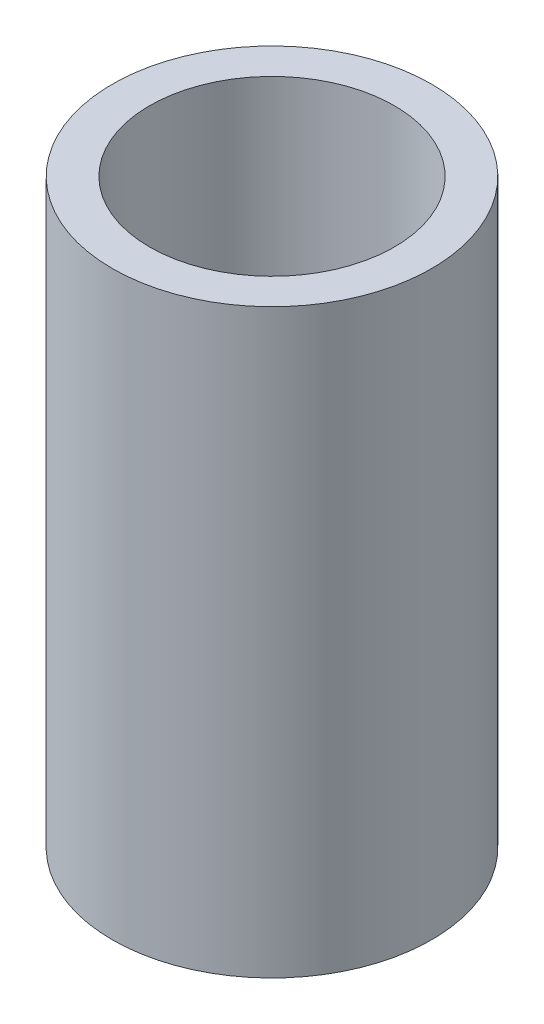
ISO-10303-21;
HEADER;
FILE_DESCRIPTION(('STEP AP214'),'2;1');
FILE_NAME('part.step','',(''),(''),'','','');
FILE_SCHEMA(('AUTOMOTIVE_DESIGN { 1 0 10303 214 1 1 1 1 }'));
ENDSEC;
DATA;
#1=APPLICATION_CONTEXT('core data for automotive mechanical design processes');
#2=APPLICATION_PROTOCOL_DEFINITION('international standard','automotive_design',2000,#1);
#3=PRODUCT_CONTEXT('',#1,'mechanical');
#4=PRODUCT('Part','Part','',(#3));
#5=PRODUCT_RELATED_PRODUCT_CATEGORY('part','',(#4));
#6=PRODUCT_DEFINITION_FORMATION('','',#4);
#7=PRODUCT_DEFINITION_CONTEXT('part definition',#1,'design');
#8=PRODUCT_DEFINITION('design','',#6,#7);
#9=PRODUCT_DEFINITION_SHAPE('','',#8);
#10=(LENGTH_UNIT() NAMED_UNIT(*) SI_UNIT(.MILLI.,.METRE.));
#11=(NAMED_UNIT(*) PLANE_ANGLE_UNIT() SI_UNIT($,.RADIAN.));
#12=(NAMED_UNIT(*) SI_UNIT($,.STERADIAN.) SOLID_ANGLE_UNIT());
#13=UNCERTAINTY_MEASURE_WITH_UNIT(LENGTH_MEASURE(1.E-05),#10,'distance_accuracy_value','');
#14=(GEOMETRIC_REPRESENTATION_CONTEXT(3) GLOBAL_UNCERTAINTY_ASSIGNED_CONTEXT((#13)) GLOBAL_UNIT_ASSIGNED_CONTEXT((#10,
#11,#12)) REPRESENTATION_CONTEXT('',''));
#15=CARTESIAN_POINT('',(0.,0.,0.));
#16=DIRECTION('',(0.,0.,1.));
#17=DIRECTION('',(1.,0.,0.));
#18=AXIS2_PLACEMENT_3D('',#15,#16,#17);
#19=CARTESIAN_POINT('',(0.,10.922,0.));
#20=DIRECTION('',(0.,1.,0.));
#21=DIRECTION('',(0.,0.,1.));
#22=AXIS2_PLACEMENT_3D('',#19,#20,#21);
#23=PLANE('',#22);
#24=CARTESIAN_POINT('',(0.,10.922,0.));
#25=DIRECTION('',(0.,1.,0.));
#26=DIRECTION('',(0.,0.,1.));
#27=AXIS2_PLACEMENT_3D('',#24,#25,#26);
#28=CIRCLE('',#27,3.);
#29=CARTESIAN_POINT('',(0.,10.922,3.));
#30=VERTEX_POINT('',#29);
#31=EDGE_CURVE('E10',#30,#30,#28,.T.);
#32=ORIENTED_EDGE('',*,*,#31,.T.);
#33=EDGE_LOOP('',(#32));
#34=FACE_BOUND('',#33,.T.);
#35=CARTESIAN_POINT('',(0.,10.922,0.));
#36=DIRECTION('',(0.,1.,0.));
#37=DIRECTION('',(0.,0.,1.));
#38=AXIS2_PLACEMENT_3D('',#35,#36,#37);
#39=CIRCLE('',#38,2.3);
#40=CARTESIAN_POINT('',(0.,10.922,2.3));
#41=VERTEX_POINT('',#40);
#42=EDGE_CURVE('E56',#41,#41,#39,.T.);
#43=ORIENTED_EDGE('',*,*,#42,.F.);
#44=EDGE_LOOP('',(#43));
#45=FACE_BOUND('',#44,.T.);
#46=ADVANCED_FACE('F43',(#34,#45),#23,.T.);
#47=CARTESIAN_POINT('',(0.,0.,0.));
#48=DIRECTION('',(0.,1.,0.));
#49=DIRECTION('',(0.,0.,1.));
#50=AXIS2_PLACEMENT_3D('',#47,#48,#49);
#51=PLANE('',#50);
#52=CARTESIAN_POINT('',(0.,0.,0.));
#53=DIRECTION('',(0.,1.,0.));
#54=DIRECTION('',(0.,0.,1.));
#55=AXIS2_PLACEMENT_3D('',#52,#53,#54);
#56=CIRCLE('',#55,3.);
#57=CARTESIAN_POINT('',(0.,0.,3.));
#58=VERTEX_POINT('',#57);
#59=EDGE_CURVE('E47',#58,#58,#56,.T.);
#60=ORIENTED_EDGE('',*,*,#59,.F.);
#61=EDGE_LOOP('',(#60));
#62=FACE_BOUND('',#61,.T.);
#63=CARTESIAN_POINT('',(0.,0.,0.));
#64=DIRECTION('',(0.,1.,0.));
#65=DIRECTION('',(0.,0.,1.));
#66=AXIS2_PLACEMENT_3D('',#63,#64,#65);
#67=CIRCLE('',#66,2.3);
#68=CARTESIAN_POINT('',(0.,0.,2.3));
#69=VERTEX_POINT('',#68);
#70=EDGE_CURVE('E58',#69,#69,#67,.T.);
#71=ORIENTED_EDGE('',*,*,#70,.T.);
#72=EDGE_LOOP('',(#71));
#73=FACE_BOUND('',#72,.T.);
#74=ADVANCED_FACE('F70',(#62,#73),#51,.F.);
#75=CARTESIAN_POINT('',(0.,10.922,0.));
#76=DIRECTION('',(0.,-1.,0.));
#77=DIRECTION('',(0.,0.,-1.));
#78=AXIS2_PLACEMENT_3D('',#75,#76,#77);
#79=CYLINDRICAL_SURFACE('',#78,3.);
#80=ORIENTED_EDGE('',*,*,#31,.F.);
#81=EDGE_LOOP('',(#80));
#82=FACE_BOUND('',#81,.T.);
#83=ORIENTED_EDGE('',*,*,#59,.T.);
#84=EDGE_LOOP('',(#83));
#85=FACE_BOUND('',#84,.T.);
#86=ADVANCED_FACE('F45',(#82,#85),#79,.T.);
#87=CARTESIAN_POINT('',(0.,10.922,0.));
#88=DIRECTION('',(0.,-1.,0.));
#89=DIRECTION('',(0.,0.,-1.));
#90=AXIS2_PLACEMENT_3D('',#87,#88,#89);
#91=CYLINDRICAL_SURFACE('',#90,2.3);
#92=ORIENTED_EDGE('',*,*,#42,.T.);
#93=EDGE_LOOP('',(#92));
#94=FACE_BOUND('',#93,.T.);
#95=ORIENTED_EDGE('',*,*,#70,.F.);
#96=EDGE_LOOP('',(#95));
#97=FACE_BOUND('',#96,.T.);
#98=ADVANCED_FACE('F66',(#94,#97),#91,.F.);
#99=CLOSED_SHELL('',(#46,#74,#86,#98));
#100=MANIFOLD_SOLID_BREP('B2',#99);
#101=ADVANCED_BREP_SHAPE_REPRESENTATION('',(#18,#100),#14);
#102=SHAPE_DEFINITION_REPRESENTATION(#9,#101);
ENDSEC;
END-ISO-10303-21;
